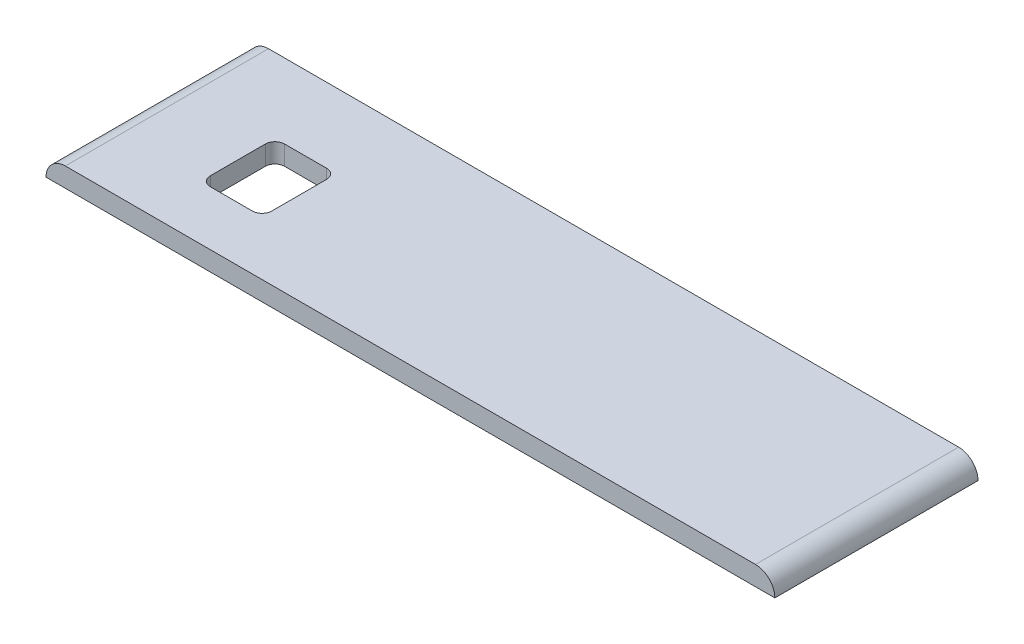
ISO-10303-21;
HEADER;
FILE_DESCRIPTION(('STEP AP214'),'2;1');
FILE_NAME('part.step','',(''),(''),'','','');
FILE_SCHEMA(('AUTOMOTIVE_DESIGN { 1 0 10303 214 1 1 1 1 }'));
ENDSEC;
DATA;
#1=APPLICATION_CONTEXT('core data for automotive mechanical design processes');
#2=APPLICATION_PROTOCOL_DEFINITION('international standard','automotive_design',2000,#1);
#3=PRODUCT_CONTEXT('',#1,'mechanical');
#4=PRODUCT('Part','Part','',(#3));
#5=PRODUCT_RELATED_PRODUCT_CATEGORY('part','',(#4));
#6=PRODUCT_DEFINITION_FORMATION('','',#4);
#7=PRODUCT_DEFINITION_CONTEXT('part definition',#1,'design');
#8=PRODUCT_DEFINITION('design','',#6,#7);
#9=PRODUCT_DEFINITION_SHAPE('','',#8);
#10=(LENGTH_UNIT() NAMED_UNIT(*) SI_UNIT(.MILLI.,.METRE.));
#11=(NAMED_UNIT(*) PLANE_ANGLE_UNIT() SI_UNIT($,.RADIAN.));
#12=(NAMED_UNIT(*) SI_UNIT($,.STERADIAN.) SOLID_ANGLE_UNIT());
#13=UNCERTAINTY_MEASURE_WITH_UNIT(LENGTH_MEASURE(1.E-05),#10,'distance_accuracy_value','');
#14=(GEOMETRIC_REPRESENTATION_CONTEXT(3) GLOBAL_UNCERTAINTY_ASSIGNED_CONTEXT((#13)) GLOBAL_UNIT_ASSIGNED_CONTEXT((#10,
#11,#12)) REPRESENTATION_CONTEXT('',''));
#15=CARTESIAN_POINT('',(0.,0.,0.));
#16=DIRECTION('',(0.,0.,1.));
#17=DIRECTION('',(1.,0.,0.));
#18=AXIS2_PLACEMENT_3D('',#15,#16,#17);
#19=CARTESIAN_POINT('',(0.,3.,0.));
#20=DIRECTION('',(0.,-1.,0.));
#21=DIRECTION('',(0.,0.,-1.));
#22=AXIS2_PLACEMENT_3D('',#19,#20,#21);
#23=PLANE('',#22);
#24=DIRECTION('',(-1.,0.,0.));
#25=VECTOR('',#24,1.);
#26=CARTESIAN_POINT('',(-3.,3.,0.));
#27=LINE('',#26,#25);
#28=CARTESIAN_POINT('',(107.,3.,0.));
#29=VERTEX_POINT('',#28);
#30=CARTESIAN_POINT('',(0.,3.,0.));
#31=VERTEX_POINT('',#30);
#32=EDGE_CURVE('E157',#29,#31,#27,.T.);
#33=ORIENTED_EDGE('',*,*,#32,.T.);
#34=DIRECTION('',(0.,0.,1.));
#35=VECTOR('',#34,1.);
#36=CARTESIAN_POINT('',(0.,3.,0.));
#37=LINE('',#36,#35);
#38=CARTESIAN_POINT('',(0.,3.,31.5));
#39=VERTEX_POINT('',#38);
#40=EDGE_CURVE('E201',#31,#39,#37,.T.);
#41=ORIENTED_EDGE('',*,*,#40,.T.);
#42=DIRECTION('',(1.,0.,0.));
#43=VECTOR('',#42,1.);
#44=CARTESIAN_POINT('',(-3.,3.,31.5));
#45=LINE('',#44,#43);
#46=CARTESIAN_POINT('',(107.,3.,31.5));
#47=VERTEX_POINT('',#46);
#48=EDGE_CURVE('E134',#39,#47,#45,.T.);
#49=ORIENTED_EDGE('',*,*,#48,.T.);
#50=DIRECTION('',(0.,0.,-1.));
#51=VECTOR('',#50,1.);
#52=CARTESIAN_POINT('',(107.,3.,0.));
#53=LINE('',#52,#51);
#54=EDGE_CURVE('E199',#47,#29,#53,.T.);
#55=ORIENTED_EDGE('',*,*,#54,.T.);
#56=EDGE_LOOP('',(#33,#41,#49,#55));
#57=FACE_BOUND('',#56,.T.);
#58=DIRECTION('',(0.,0.,1.));
#59=VECTOR('',#58,1.);
#60=CARTESIAN_POINT('',(12.55,3.,23.05));
#61=LINE('',#60,#59);
#62=CARTESIAN_POINT('',(12.55,3.,13.05));
#63=VERTEX_POINT('',#62);
#64=CARTESIAN_POINT('',(12.55,3.,21.55));
#65=VERTEX_POINT('',#64);
#66=EDGE_CURVE('E210',#63,#65,#61,.T.);
#67=ORIENTED_EDGE('',*,*,#66,.F.);
#68=CARTESIAN_POINT('',(14.05,3.,13.05));
#69=DIRECTION('',(0.,-1.,0.));
#70=DIRECTION('',(0.,0.,-1.));
#71=AXIS2_PLACEMENT_3D('',#68,#69,#70);
#72=CIRCLE('',#71,1.5);
#73=CARTESIAN_POINT('',(14.05,3.,11.55));
#74=VERTEX_POINT('',#73);
#75=EDGE_CURVE('E185',#63,#74,#72,.T.);
#76=ORIENTED_EDGE('',*,*,#75,.T.);
#77=DIRECTION('',(-1.,0.,0.));
#78=VECTOR('',#77,1.);
#79=CARTESIAN_POINT('',(12.55,3.,11.55));
#80=LINE('',#79,#78);
#81=CARTESIAN_POINT('',(20.55,3.,11.55));
#82=VERTEX_POINT('',#81);
#83=EDGE_CURVE('E151',#82,#74,#80,.T.);
#84=ORIENTED_EDGE('',*,*,#83,.F.);
#85=CARTESIAN_POINT('',(20.55,3.,13.05));
#86=DIRECTION('',(0.,-1.,0.));
#87=DIRECTION('',(0.,0.,-1.));
#88=AXIS2_PLACEMENT_3D('',#85,#86,#87);
#89=CIRCLE('',#88,1.5);
#90=CARTESIAN_POINT('',(22.05,3.,13.05));
#91=VERTEX_POINT('',#90);
#92=EDGE_CURVE('E189',#82,#91,#89,.T.);
#93=ORIENTED_EDGE('',*,*,#92,.T.);
#94=DIRECTION('',(0.,0.,-1.));
#95=VECTOR('',#94,1.);
#96=CARTESIAN_POINT('',(22.05,3.,23.05));
#97=LINE('',#96,#95);
#98=CARTESIAN_POINT('',(22.05,3.,21.55));
#99=VERTEX_POINT('',#98);
#100=EDGE_CURVE('E154',#99,#91,#97,.T.);
#101=ORIENTED_EDGE('',*,*,#100,.F.);
#102=CARTESIAN_POINT('',(20.55,3.,21.55));
#103=DIRECTION('',(0.,-1.,0.));
#104=DIRECTION('',(0.,0.,-1.));
#105=AXIS2_PLACEMENT_3D('',#102,#103,#104);
#106=CIRCLE('',#105,1.5);
#107=CARTESIAN_POINT('',(20.55,3.,23.05));
#108=VERTEX_POINT('',#107);
#109=EDGE_CURVE('E193',#99,#108,#106,.T.);
#110=ORIENTED_EDGE('',*,*,#109,.T.);
#111=DIRECTION('',(1.,0.,0.));
#112=VECTOR('',#111,1.);
#113=CARTESIAN_POINT('',(12.55,3.,23.05));
#114=LINE('',#113,#112);
#115=CARTESIAN_POINT('',(14.05,3.,23.05));
#116=VERTEX_POINT('',#115);
#117=EDGE_CURVE('E222',#116,#108,#114,.T.);
#118=ORIENTED_EDGE('',*,*,#117,.F.);
#119=CARTESIAN_POINT('',(14.05,3.,21.55));
#120=DIRECTION('',(0.,-1.,0.));
#121=DIRECTION('',(0.,0.,-1.));
#122=AXIS2_PLACEMENT_3D('',#119,#120,#121);
#123=CIRCLE('',#122,1.5);
#124=EDGE_CURVE('E197',#116,#65,#123,.T.);
#125=ORIENTED_EDGE('',*,*,#124,.T.);
#126=EDGE_LOOP('',(#67,#76,#84,#93,#101,#110,#118,#125));
#127=FACE_BOUND('',#126,.T.);
#128=ADVANCED_FACE('F41',(#57,#127),#23,.F.);
#129=CARTESIAN_POINT('',(0.,0.,0.));
#130=DIRECTION('',(0.,-1.,0.));
#131=DIRECTION('',(0.,0.,-1.));
#132=AXIS2_PLACEMENT_3D('',#129,#130,#131);
#133=PLANE('',#132);
#134=DIRECTION('',(0.,0.,1.));
#135=VECTOR('',#134,1.);
#136=CARTESIAN_POINT('',(-3.,0.,31.5));
#137=LINE('',#136,#135);
#138=CARTESIAN_POINT('',(-3.,0.,0.));
#139=VERTEX_POINT('',#138);
#140=CARTESIAN_POINT('',(-3.,0.,31.5));
#141=VERTEX_POINT('',#140);
#142=EDGE_CURVE('E146',#139,#141,#137,.T.);
#143=ORIENTED_EDGE('',*,*,#142,.F.);
#144=DIRECTION('',(-1.,0.,0.));
#145=VECTOR('',#144,1.);
#146=CARTESIAN_POINT('',(-3.,0.,0.));
#147=LINE('',#146,#145);
#148=CARTESIAN_POINT('',(110.,0.,0.));
#149=VERTEX_POINT('',#148);
#150=EDGE_CURVE('E161',#149,#139,#147,.T.);
#151=ORIENTED_EDGE('',*,*,#150,.F.);
#152=DIRECTION('',(0.,0.,-1.));
#153=VECTOR('',#152,1.);
#154=CARTESIAN_POINT('',(110.,0.,31.5));
#155=LINE('',#154,#153);
#156=CARTESIAN_POINT('',(110.,0.,31.5));
#157=VERTEX_POINT('',#156);
#158=EDGE_CURVE('E147',#157,#149,#155,.T.);
#159=ORIENTED_EDGE('',*,*,#158,.F.);
#160=DIRECTION('',(1.,0.,0.));
#161=VECTOR('',#160,1.);
#162=CARTESIAN_POINT('',(-3.,0.,31.5));
#163=LINE('',#162,#161);
#164=EDGE_CURVE('E131',#141,#157,#163,.T.);
#165=ORIENTED_EDGE('',*,*,#164,.F.);
#166=EDGE_LOOP('',(#143,#151,#159,#165));
#167=FACE_BOUND('',#166,.T.);
#168=DIRECTION('',(0.,0.,-1.));
#169=VECTOR('',#168,1.);
#170=CARTESIAN_POINT('',(22.05,0.,23.05));
#171=LINE('',#170,#169);
#172=CARTESIAN_POINT('',(22.05,0.,21.55));
#173=VERTEX_POINT('',#172);
#174=CARTESIAN_POINT('',(22.05,0.,13.05));
#175=VERTEX_POINT('',#174);
#176=EDGE_CURVE('E211',#173,#175,#171,.T.);
#177=ORIENTED_EDGE('',*,*,#176,.T.);
#178=CARTESIAN_POINT('',(20.55,0.,13.05));
#179=DIRECTION('',(0.,-1.,0.));
#180=DIRECTION('',(0.,0.,-1.));
#181=AXIS2_PLACEMENT_3D('',#178,#179,#180);
#182=CIRCLE('',#181,1.5);
#183=CARTESIAN_POINT('',(20.55,0.,11.55));
#184=VERTEX_POINT('',#183);
#185=EDGE_CURVE('E187',#175,#184,#182,.F.);
#186=ORIENTED_EDGE('',*,*,#185,.T.);
#187=DIRECTION('',(-1.,0.,0.));
#188=VECTOR('',#187,1.);
#189=CARTESIAN_POINT('',(12.55,0.,11.55));
#190=LINE('',#189,#188);
#191=CARTESIAN_POINT('',(14.05,0.,11.55));
#192=VERTEX_POINT('',#191);
#193=EDGE_CURVE('E207',#184,#192,#190,.T.);
#194=ORIENTED_EDGE('',*,*,#193,.T.);
#195=CARTESIAN_POINT('',(14.05,0.,13.05));
#196=DIRECTION('',(0.,-1.,0.));
#197=DIRECTION('',(0.,0.,-1.));
#198=AXIS2_PLACEMENT_3D('',#195,#196,#197);
#199=CIRCLE('',#198,1.5);
#200=CARTESIAN_POINT('',(12.55,0.,13.05));
#201=VERTEX_POINT('',#200);
#202=EDGE_CURVE('E183',#192,#201,#199,.F.);
#203=ORIENTED_EDGE('',*,*,#202,.T.);
#204=DIRECTION('',(0.,0.,1.));
#205=VECTOR('',#204,1.);
#206=CARTESIAN_POINT('',(12.55,0.,23.05));
#207=LINE('',#206,#205);
#208=CARTESIAN_POINT('',(12.55,0.,21.55));
#209=VERTEX_POINT('',#208);
#210=EDGE_CURVE('E217',#201,#209,#207,.T.);
#211=ORIENTED_EDGE('',*,*,#210,.T.);
#212=CARTESIAN_POINT('',(14.05,0.,21.55));
#213=DIRECTION('',(0.,-1.,0.));
#214=DIRECTION('',(0.,0.,-1.));
#215=AXIS2_PLACEMENT_3D('',#212,#213,#214);
#216=CIRCLE('',#215,1.5);
#217=CARTESIAN_POINT('',(14.05,0.,23.05));
#218=VERTEX_POINT('',#217);
#219=EDGE_CURVE('E195',#209,#218,#216,.F.);
#220=ORIENTED_EDGE('',*,*,#219,.T.);
#221=DIRECTION('',(1.,0.,0.));
#222=VECTOR('',#221,1.);
#223=CARTESIAN_POINT('',(12.55,0.,23.05));
#224=LINE('',#223,#222);
#225=CARTESIAN_POINT('',(20.55,0.,23.05));
#226=VERTEX_POINT('',#225);
#227=EDGE_CURVE('E214',#218,#226,#224,.T.);
#228=ORIENTED_EDGE('',*,*,#227,.T.);
#229=CARTESIAN_POINT('',(20.55,0.,21.55));
#230=DIRECTION('',(0.,-1.,0.));
#231=DIRECTION('',(0.,0.,-1.));
#232=AXIS2_PLACEMENT_3D('',#229,#230,#231);
#233=CIRCLE('',#232,1.5);
#234=EDGE_CURVE('E191',#226,#173,#233,.F.);
#235=ORIENTED_EDGE('',*,*,#234,.T.);
#236=EDGE_LOOP('',(#177,#186,#194,#203,#211,#220,#228,#235));
#237=FACE_BOUND('',#236,.T.);
#238=ADVANCED_FACE('F143',(#167,#237),#133,.T.);
#239=CARTESIAN_POINT('',(-3.,3.,31.5));
#240=DIRECTION('',(0.,0.,-1.));
#241=DIRECTION('',(-1.,0.,0.));
#242=AXIS2_PLACEMENT_3D('',#239,#240,#241);
#243=PLANE('',#242);
#244=ORIENTED_EDGE('',*,*,#48,.F.);
#245=CARTESIAN_POINT('',(0.,0.,31.5));
#246=DIRECTION('',(0.,0.,-1.));
#247=DIRECTION('',(-1.,0.,0.));
#248=AXIS2_PLACEMENT_3D('',#245,#246,#247);
#249=CIRCLE('',#248,3.);
#250=EDGE_CURVE('E128',#39,#141,#249,.F.);
#251=ORIENTED_EDGE('',*,*,#250,.T.);
#252=ORIENTED_EDGE('',*,*,#164,.T.);
#253=CARTESIAN_POINT('',(107.,0.,31.5));
#254=DIRECTION('',(0.,0.,-1.));
#255=DIRECTION('',(-1.,0.,0.));
#256=AXIS2_PLACEMENT_3D('',#253,#254,#255);
#257=CIRCLE('',#256,3.);
#258=EDGE_CURVE('E139',#157,#47,#257,.F.);
#259=ORIENTED_EDGE('',*,*,#258,.T.);
#260=EDGE_LOOP('',(#244,#251,#252,#259));
#261=FACE_BOUND('',#260,.T.);
#262=ADVANCED_FACE('F130',(#261),#243,.F.);
#263=CARTESIAN_POINT('',(-3.,3.,0.));
#264=DIRECTION('',(0.,0.,1.));
#265=DIRECTION('',(1.,0.,0.));
#266=AXIS2_PLACEMENT_3D('',#263,#264,#265);
#267=PLANE('',#266);
#268=ORIENTED_EDGE('',*,*,#150,.T.);
#269=CARTESIAN_POINT('',(0.,0.,0.));
#270=DIRECTION('',(0.,0.,1.));
#271=DIRECTION('',(1.,0.,0.));
#272=AXIS2_PLACEMENT_3D('',#269,#270,#271);
#273=CIRCLE('',#272,3.);
#274=EDGE_CURVE('E11',#139,#31,#273,.F.);
#275=ORIENTED_EDGE('',*,*,#274,.T.);
#276=ORIENTED_EDGE('',*,*,#32,.F.);
#277=CARTESIAN_POINT('',(107.,0.,0.));
#278=DIRECTION('',(0.,0.,1.));
#279=DIRECTION('',(1.,0.,0.));
#280=AXIS2_PLACEMENT_3D('',#277,#278,#279);
#281=CIRCLE('',#280,3.);
#282=EDGE_CURVE('E49',#29,#149,#281,.F.);
#283=ORIENTED_EDGE('',*,*,#282,.T.);
#284=EDGE_LOOP('',(#268,#275,#276,#283));
#285=FACE_BOUND('',#284,.T.);
#286=ADVANCED_FACE('F203',(#285),#267,.F.);
#287=CARTESIAN_POINT('',(12.55,3.,23.05));
#288=DIRECTION('',(1.,0.,0.));
#289=DIRECTION('',(0.,0.,-1.));
#290=AXIS2_PLACEMENT_3D('',#287,#288,#289);
#291=PLANE('',#290);
#292=ORIENTED_EDGE('',*,*,#210,.F.);
#293=DIRECTION('',(0.,-1.,0.));
#294=VECTOR('',#293,1.);
#295=CARTESIAN_POINT('',(12.55,3.,13.05));
#296=LINE('',#295,#294);
#297=EDGE_CURVE('E171',#201,#63,#296,.F.);
#298=ORIENTED_EDGE('',*,*,#297,.T.);
#299=ORIENTED_EDGE('',*,*,#66,.T.);
#300=DIRECTION('',(0.,-1.,0.));
#301=VECTOR('',#300,1.);
#302=CARTESIAN_POINT('',(12.55,0.,21.55));
#303=LINE('',#302,#301);
#304=EDGE_CURVE('E168',#65,#209,#303,.T.);
#305=ORIENTED_EDGE('',*,*,#304,.T.);
#306=EDGE_LOOP('',(#292,#298,#299,#305));
#307=FACE_BOUND('',#306,.T.);
#308=ADVANCED_FACE('F230',(#307),#291,.T.);
#309=CARTESIAN_POINT('',(12.55,3.,23.05));
#310=DIRECTION('',(0.,0.,-1.));
#311=DIRECTION('',(-1.,0.,0.));
#312=AXIS2_PLACEMENT_3D('',#309,#310,#311);
#313=PLANE('',#312);
#314=ORIENTED_EDGE('',*,*,#117,.T.);
#315=DIRECTION('',(0.,-1.,0.));
#316=VECTOR('',#315,1.);
#317=CARTESIAN_POINT('',(20.55,0.,23.05));
#318=LINE('',#317,#316);
#319=EDGE_CURVE('E180',#108,#226,#318,.T.);
#320=ORIENTED_EDGE('',*,*,#319,.T.);
#321=ORIENTED_EDGE('',*,*,#227,.F.);
#322=DIRECTION('',(0.,-1.,0.));
#323=VECTOR('',#322,1.);
#324=CARTESIAN_POINT('',(14.05,3.,23.05));
#325=LINE('',#324,#323);
#326=EDGE_CURVE('E178',#218,#116,#325,.F.);
#327=ORIENTED_EDGE('',*,*,#326,.T.);
#328=EDGE_LOOP('',(#314,#320,#321,#327));
#329=FACE_BOUND('',#328,.T.);
#330=ADVANCED_FACE('F239',(#329),#313,.T.);
#331=CARTESIAN_POINT('',(22.05,3.,23.05));
#332=DIRECTION('',(-1.,0.,0.));
#333=DIRECTION('',(0.,0.,1.));
#334=AXIS2_PLACEMENT_3D('',#331,#332,#333);
#335=PLANE('',#334);
#336=ORIENTED_EDGE('',*,*,#100,.T.);
#337=DIRECTION('',(0.,-1.,0.));
#338=VECTOR('',#337,1.);
#339=CARTESIAN_POINT('',(22.05,0.,13.05));
#340=LINE('',#339,#338);
#341=EDGE_CURVE('E175',#91,#175,#340,.T.);
#342=ORIENTED_EDGE('',*,*,#341,.T.);
#343=ORIENTED_EDGE('',*,*,#176,.F.);
#344=DIRECTION('',(0.,-1.,0.));
#345=VECTOR('',#344,1.);
#346=CARTESIAN_POINT('',(22.05,3.,21.55));
#347=LINE('',#346,#345);
#348=EDGE_CURVE('E173',#173,#99,#347,.F.);
#349=ORIENTED_EDGE('',*,*,#348,.T.);
#350=EDGE_LOOP('',(#336,#342,#343,#349));
#351=FACE_BOUND('',#350,.T.);
#352=ADVANCED_FACE('F248',(#351),#335,.T.);
#353=CARTESIAN_POINT('',(12.55,3.,11.55));
#354=DIRECTION('',(0.,0.,1.));
#355=DIRECTION('',(1.,0.,0.));
#356=AXIS2_PLACEMENT_3D('',#353,#354,#355);
#357=PLANE('',#356);
#358=ORIENTED_EDGE('',*,*,#83,.T.);
#359=DIRECTION('',(0.,-1.,0.));
#360=VECTOR('',#359,1.);
#361=CARTESIAN_POINT('',(14.05,0.,11.55));
#362=LINE('',#361,#360);
#363=EDGE_CURVE('E165',#74,#192,#362,.T.);
#364=ORIENTED_EDGE('',*,*,#363,.T.);
#365=ORIENTED_EDGE('',*,*,#193,.F.);
#366=DIRECTION('',(0.,-1.,0.));
#367=VECTOR('',#366,1.);
#368=CARTESIAN_POINT('',(20.55,3.,11.55));
#369=LINE('',#368,#367);
#370=EDGE_CURVE('E163',#184,#82,#369,.F.);
#371=ORIENTED_EDGE('',*,*,#370,.T.);
#372=EDGE_LOOP('',(#358,#364,#365,#371));
#373=FACE_BOUND('',#372,.T.);
#374=ADVANCED_FACE('F257',(#373),#357,.T.);
#375=CARTESIAN_POINT('',(14.05,3.,13.05));
#376=DIRECTION('',(0.,1.,0.));
#377=DIRECTION('',(0.,0.,1.));
#378=AXIS2_PLACEMENT_3D('',#375,#376,#377);
#379=CYLINDRICAL_SURFACE('',#378,1.5);
#380=ORIENTED_EDGE('',*,*,#75,.F.);
#381=ORIENTED_EDGE('',*,*,#297,.F.);
#382=ORIENTED_EDGE('',*,*,#202,.F.);
#383=ORIENTED_EDGE('',*,*,#363,.F.);
#384=EDGE_LOOP('',(#380,#381,#382,#383));
#385=FACE_BOUND('',#384,.T.);
#386=ADVANCED_FACE('F261',(#385),#379,.F.);
#387=CARTESIAN_POINT('',(20.55,3.,13.05));
#388=DIRECTION('',(0.,1.,0.));
#389=DIRECTION('',(0.,0.,1.));
#390=AXIS2_PLACEMENT_3D('',#387,#388,#389);
#391=CYLINDRICAL_SURFACE('',#390,1.5);
#392=ORIENTED_EDGE('',*,*,#92,.F.);
#393=ORIENTED_EDGE('',*,*,#370,.F.);
#394=ORIENTED_EDGE('',*,*,#185,.F.);
#395=ORIENTED_EDGE('',*,*,#341,.F.);
#396=EDGE_LOOP('',(#392,#393,#394,#395));
#397=FACE_BOUND('',#396,.T.);
#398=ADVANCED_FACE('F253',(#397),#391,.F.);
#399=CARTESIAN_POINT('',(20.55,3.,21.55));
#400=DIRECTION('',(0.,1.,0.));
#401=DIRECTION('',(0.,0.,1.));
#402=AXIS2_PLACEMENT_3D('',#399,#400,#401);
#403=CYLINDRICAL_SURFACE('',#402,1.5);
#404=ORIENTED_EDGE('',*,*,#109,.F.);
#405=ORIENTED_EDGE('',*,*,#348,.F.);
#406=ORIENTED_EDGE('',*,*,#234,.F.);
#407=ORIENTED_EDGE('',*,*,#319,.F.);
#408=EDGE_LOOP('',(#404,#405,#406,#407));
#409=FACE_BOUND('',#408,.T.);
#410=ADVANCED_FACE('F244',(#409),#403,.F.);
#411=CARTESIAN_POINT('',(14.05,3.,21.55));
#412=DIRECTION('',(0.,1.,0.));
#413=DIRECTION('',(0.,0.,1.));
#414=AXIS2_PLACEMENT_3D('',#411,#412,#413);
#415=CYLINDRICAL_SURFACE('',#414,1.5);
#416=ORIENTED_EDGE('',*,*,#124,.F.);
#417=ORIENTED_EDGE('',*,*,#326,.F.);
#418=ORIENTED_EDGE('',*,*,#219,.F.);
#419=ORIENTED_EDGE('',*,*,#304,.F.);
#420=EDGE_LOOP('',(#416,#417,#418,#419));
#421=FACE_BOUND('',#420,.T.);
#422=ADVANCED_FACE('F235',(#421),#415,.F.);
#423=CARTESIAN_POINT('',(0.,0.,0.));
#424=DIRECTION('',(0.,0.,1.));
#425=DIRECTION('',(1.,0.,0.));
#426=AXIS2_PLACEMENT_3D('',#423,#424,#425);
#427=CYLINDRICAL_SURFACE('',#426,3.);
#428=ORIENTED_EDGE('',*,*,#274,.F.);
#429=ORIENTED_EDGE('',*,*,#142,.T.);
#430=ORIENTED_EDGE('',*,*,#250,.F.);
#431=ORIENTED_EDGE('',*,*,#40,.F.);
#432=EDGE_LOOP('',(#428,#429,#430,#431));
#433=FACE_BOUND('',#432,.T.);
#434=ADVANCED_FACE('F150',(#433),#427,.T.);
#435=CARTESIAN_POINT('',(107.,0.,0.));
#436=DIRECTION('',(0.,0.,-1.));
#437=DIRECTION('',(-1.,0.,0.));
#438=AXIS2_PLACEMENT_3D('',#435,#436,#437);
#439=CYLINDRICAL_SURFACE('',#438,3.);
#440=ORIENTED_EDGE('',*,*,#258,.F.);
#441=ORIENTED_EDGE('',*,*,#158,.T.);
#442=ORIENTED_EDGE('',*,*,#282,.F.);
#443=ORIENTED_EDGE('',*,*,#54,.F.);
#444=EDGE_LOOP('',(#440,#441,#442,#443));
#445=FACE_BOUND('',#444,.T.);
#446=ADVANCED_FACE('F43',(#445),#439,.T.);
#447=CLOSED_SHELL('',(#128,#238,#262,#286,#308,#330,#352,#374,#386,#398,#410,#422,#434,#446));
#448=MANIFOLD_SOLID_BREP('B2',#447);
#449=ADVANCED_BREP_SHAPE_REPRESENTATION('',(#18,#448),#14);
#450=SHAPE_DEFINITION_REPRESENTATION(#9,#449);
ENDSEC;
END-ISO-10303-21;
